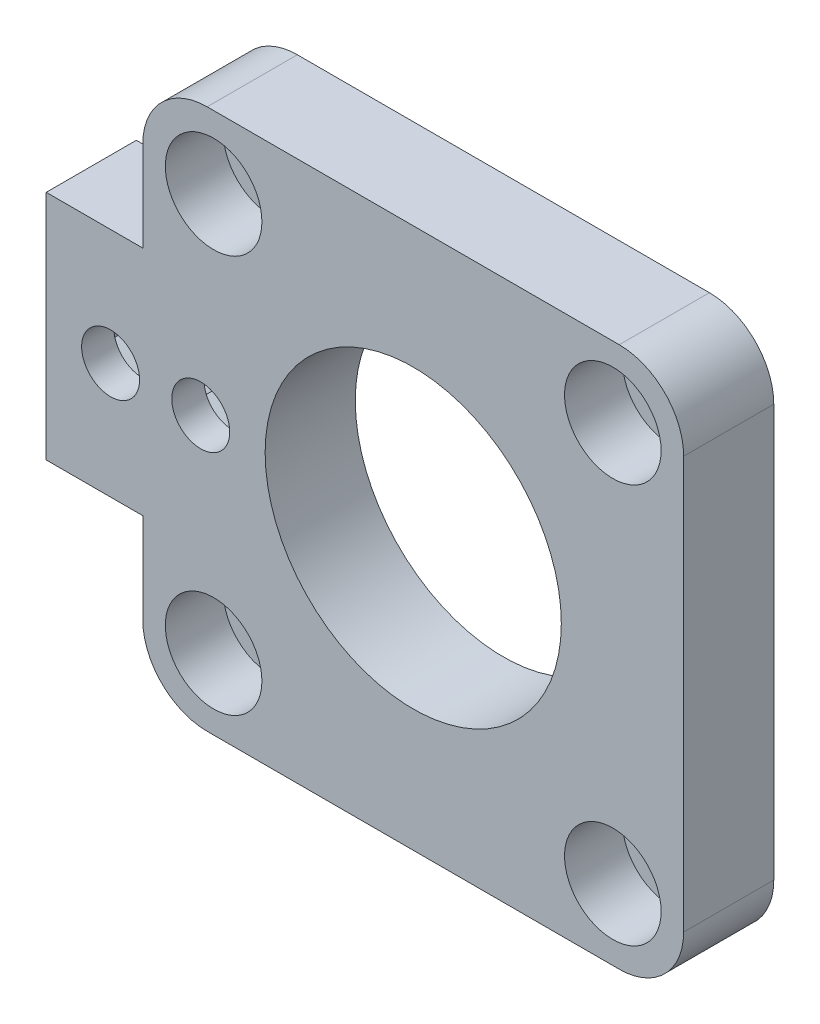
ISO-10303-21;
HEADER;
FILE_DESCRIPTION(('STEP AP214'),'2;1');
FILE_NAME('part.step','',(''),(''),'','','');
FILE_SCHEMA(('AUTOMOTIVE_DESIGN { 1 0 10303 214 1 1 1 1 }'));
ENDSEC;
DATA;
#1=APPLICATION_CONTEXT('core data for automotive mechanical design processes');
#2=APPLICATION_PROTOCOL_DEFINITION('international standard','automotive_design',2000,#1);
#3=PRODUCT_CONTEXT('',#1,'mechanical');
#4=PRODUCT('Part','Part','',(#3));
#5=PRODUCT_RELATED_PRODUCT_CATEGORY('part','',(#4));
#6=PRODUCT_DEFINITION_FORMATION('','',#4);
#7=PRODUCT_DEFINITION_CONTEXT('part definition',#1,'design');
#8=PRODUCT_DEFINITION('design','',#6,#7);
#9=PRODUCT_DEFINITION_SHAPE('','',#8);
#10=(LENGTH_UNIT() NAMED_UNIT(*) SI_UNIT(.MILLI.,.METRE.));
#11=(NAMED_UNIT(*) PLANE_ANGLE_UNIT() SI_UNIT($,.RADIAN.));
#12=(NAMED_UNIT(*) SI_UNIT($,.STERADIAN.) SOLID_ANGLE_UNIT());
#13=UNCERTAINTY_MEASURE_WITH_UNIT(LENGTH_MEASURE(1.E-05),#10,'distance_accuracy_value','');
#14=(GEOMETRIC_REPRESENTATION_CONTEXT(3) GLOBAL_UNCERTAINTY_ASSIGNED_CONTEXT((#13)) GLOBAL_UNIT_ASSIGNED_CONTEXT((#10,
#11,#12)) REPRESENTATION_CONTEXT('',''));
#15=CARTESIAN_POINT('',(0.,0.,0.));
#16=DIRECTION('',(0.,0.,1.));
#17=DIRECTION('',(1.,0.,0.));
#18=AXIS2_PLACEMENT_3D('',#15,#16,#17);
#19=CARTESIAN_POINT('',(-5.5,-5.5,7.));
#20=DIRECTION('',(0.,0.,-1.));
#21=DIRECTION('',(-1.,0.,0.));
#22=AXIS2_PLACEMENT_3D('',#19,#20,#21);
#23=CYLINDRICAL_SURFACE('',#22,1.75);
#24=CARTESIAN_POINT('',(-5.5,-5.5,0.));
#25=DIRECTION('',(0.,0.,1.));
#26=DIRECTION('',(1.,0.,0.));
#27=AXIS2_PLACEMENT_3D('',#24,#25,#26);
#28=CIRCLE('',#27,1.75);
#29=CARTESIAN_POINT('',(-3.75,-5.5,0.));
#30=VERTEX_POINT('',#29);
#31=EDGE_CURVE('E457',#30,#30,#28,.T.);
#32=ORIENTED_EDGE('',*,*,#31,.F.);
#33=EDGE_LOOP('',(#32));
#34=FACE_BOUND('',#33,.T.);
#35=CARTESIAN_POINT('',(-5.5,-5.5,2.5));
#36=DIRECTION('',(0.,0.,1.));
#37=DIRECTION('',(1.,0.,0.));
#38=AXIS2_PLACEMENT_3D('',#35,#36,#37);
#39=CIRCLE('',#38,1.75);
#40=CARTESIAN_POINT('',(-3.75,-5.5,2.5));
#41=VERTEX_POINT('',#40);
#42=EDGE_CURVE('E502',#41,#41,#39,.T.);
#43=ORIENTED_EDGE('',*,*,#42,.T.);
#44=EDGE_LOOP('',(#43));
#45=FACE_BOUND('',#44,.T.);
#46=ADVANCED_FACE('F167',(#34,#45),#23,.F.);
#47=CARTESIAN_POINT('',(-5.5,-36.5,7.));
#48=DIRECTION('',(0.,0.,-1.));
#49=DIRECTION('',(-1.,0.,0.));
#50=AXIS2_PLACEMENT_3D('',#47,#48,#49);
#51=CYLINDRICAL_SURFACE('',#50,1.75);
#52=CARTESIAN_POINT('',(-5.5,-36.5,0.));
#53=DIRECTION('',(0.,0.,1.));
#54=DIRECTION('',(1.,0.,0.));
#55=AXIS2_PLACEMENT_3D('',#52,#53,#54);
#56=CIRCLE('',#55,1.75);
#57=CARTESIAN_POINT('',(-3.74999999999999,-36.5,0.));
#58=VERTEX_POINT('',#57);
#59=EDGE_CURVE('E454',#58,#58,#56,.T.);
#60=ORIENTED_EDGE('',*,*,#59,.F.);
#61=EDGE_LOOP('',(#60));
#62=FACE_BOUND('',#61,.T.);
#63=CARTESIAN_POINT('',(-5.5,-36.5,2.5));
#64=DIRECTION('',(0.,0.,1.));
#65=DIRECTION('',(1.,0.,0.));
#66=AXIS2_PLACEMENT_3D('',#63,#64,#65);
#67=CIRCLE('',#66,1.75);
#68=CARTESIAN_POINT('',(-3.74999999999999,-36.5,2.5));
#69=VERTEX_POINT('',#68);
#70=EDGE_CURVE('E498',#69,#69,#67,.T.);
#71=ORIENTED_EDGE('',*,*,#70,.T.);
#72=EDGE_LOOP('',(#71));
#73=FACE_BOUND('',#72,.T.);
#74=ADVANCED_FACE('F589',(#62,#73),#51,.F.);
#75=CARTESIAN_POINT('',(-36.5,-36.5,7.));
#76=DIRECTION('',(0.,0.,-1.));
#77=DIRECTION('',(-1.,0.,0.));
#78=AXIS2_PLACEMENT_3D('',#75,#76,#77);
#79=CYLINDRICAL_SURFACE('',#78,1.75);
#80=CARTESIAN_POINT('',(-36.5,-36.5,0.));
#81=DIRECTION('',(0.,0.,1.));
#82=DIRECTION('',(1.,0.,0.));
#83=AXIS2_PLACEMENT_3D('',#80,#81,#82);
#84=CIRCLE('',#83,1.75);
#85=CARTESIAN_POINT('',(-34.75,-36.5,0.));
#86=VERTEX_POINT('',#85);
#87=EDGE_CURVE('E451',#86,#86,#84,.T.);
#88=ORIENTED_EDGE('',*,*,#87,.F.);
#89=EDGE_LOOP('',(#88));
#90=FACE_BOUND('',#89,.T.);
#91=CARTESIAN_POINT('',(-36.5,-36.5,2.5));
#92=DIRECTION('',(0.,0.,1.));
#93=DIRECTION('',(1.,0.,0.));
#94=AXIS2_PLACEMENT_3D('',#91,#92,#93);
#95=CIRCLE('',#94,1.75);
#96=CARTESIAN_POINT('',(-34.75,-36.5,2.5));
#97=VERTEX_POINT('',#96);
#98=EDGE_CURVE('E495',#97,#97,#95,.T.);
#99=ORIENTED_EDGE('',*,*,#98,.T.);
#100=EDGE_LOOP('',(#99));
#101=FACE_BOUND('',#100,.T.);
#102=ADVANCED_FACE('F595',(#90,#101),#79,.F.);
#103=CARTESIAN_POINT('',(-36.5,-5.61104091178623,7.));
#104=DIRECTION('',(0.,0.,-1.));
#105=DIRECTION('',(-1.,0.,0.));
#106=AXIS2_PLACEMENT_3D('',#103,#104,#105);
#107=CYLINDRICAL_SURFACE('',#106,1.75);
#108=CARTESIAN_POINT('',(-36.5,-5.61104091178623,0.));
#109=DIRECTION('',(0.,0.,1.));
#110=DIRECTION('',(1.,0.,0.));
#111=AXIS2_PLACEMENT_3D('',#108,#109,#110);
#112=CIRCLE('',#111,1.75);
#113=CARTESIAN_POINT('',(-34.75,-5.61104091178623,0.));
#114=VERTEX_POINT('',#113);
#115=EDGE_CURVE('E460',#114,#114,#112,.T.);
#116=ORIENTED_EDGE('',*,*,#115,.F.);
#117=EDGE_LOOP('',(#116));
#118=FACE_BOUND('',#117,.T.);
#119=CARTESIAN_POINT('',(-36.5,-5.61104091178623,2.5));
#120=DIRECTION('',(0.,0.,1.));
#121=DIRECTION('',(1.,0.,0.));
#122=AXIS2_PLACEMENT_3D('',#119,#120,#121);
#123=CIRCLE('',#122,1.75);
#124=CARTESIAN_POINT('',(-34.75,-5.61104091178623,2.5));
#125=VERTEX_POINT('',#124);
#126=EDGE_CURVE('E399',#125,#125,#123,.T.);
#127=ORIENTED_EDGE('',*,*,#126,.T.);
#128=EDGE_LOOP('',(#127));
#129=FACE_BOUND('',#128,.T.);
#130=ADVANCED_FACE('F601',(#118,#129),#107,.F.);
#131=CARTESIAN_POINT('',(-37.5,-21.,-10.));
#132=DIRECTION('',(0.,0.,1.));
#133=DIRECTION('',(1.,0.,0.));
#134=AXIS2_PLACEMENT_3D('',#131,#132,#133);
#135=CYLINDRICAL_SURFACE('',#134,2.25);
#136=CARTESIAN_POINT('',(-37.5,-21.,7.));
#137=DIRECTION('',(0.,0.,1.));
#138=DIRECTION('',(1.,0.,0.));
#139=AXIS2_PLACEMENT_3D('',#136,#137,#138);
#140=CIRCLE('',#139,2.25);
#141=CARTESIAN_POINT('',(-35.25,-21.,7.));
#142=VERTEX_POINT('',#141);
#143=EDGE_CURVE('E421',#142,#142,#140,.T.);
#144=ORIENTED_EDGE('',*,*,#143,.T.);
#145=EDGE_LOOP('',(#144));
#146=FACE_BOUND('',#145,.T.);
#147=CARTESIAN_POINT('',(-37.5,-21.,4.5));
#148=DIRECTION('',(0.,0.,-1.));
#149=DIRECTION('',(-1.,0.,0.));
#150=AXIS2_PLACEMENT_3D('',#147,#148,#149);
#151=CIRCLE('',#150,2.25);
#152=CARTESIAN_POINT('',(-39.75,-21.,4.5));
#153=VERTEX_POINT('',#152);
#154=EDGE_CURVE('E367',#153,#153,#151,.F.);
#155=ORIENTED_EDGE('',*,*,#154,.F.);
#156=EDGE_LOOP('',(#155));
#157=FACE_BOUND('',#156,.T.);
#158=ADVANCED_FACE('F732',(#146,#157),#135,.F.);
#159=CARTESIAN_POINT('',(-44.5,-21.,-10.));
#160=DIRECTION('',(0.,0.,1.));
#161=DIRECTION('',(1.,0.,0.));
#162=AXIS2_PLACEMENT_3D('',#159,#160,#161);
#163=CYLINDRICAL_SURFACE('',#162,2.25);
#164=CARTESIAN_POINT('',(-44.5,-21.,7.));
#165=DIRECTION('',(0.,0.,1.));
#166=DIRECTION('',(1.,0.,0.));
#167=AXIS2_PLACEMENT_3D('',#164,#165,#166);
#168=CIRCLE('',#167,2.25);
#169=CARTESIAN_POINT('',(-42.25,-21.,7.));
#170=VERTEX_POINT('',#169);
#171=EDGE_CURVE('E418',#170,#170,#168,.T.);
#172=ORIENTED_EDGE('',*,*,#171,.T.);
#173=EDGE_LOOP('',(#172));
#174=FACE_BOUND('',#173,.T.);
#175=CARTESIAN_POINT('',(-44.5,-21.,4.5));
#176=DIRECTION('',(0.,0.,-1.));
#177=DIRECTION('',(-1.,0.,0.));
#178=AXIS2_PLACEMENT_3D('',#175,#176,#177);
#179=CIRCLE('',#178,2.25);
#180=CARTESIAN_POINT('',(-46.75,-21.,4.5));
#181=VERTEX_POINT('',#180);
#182=EDGE_CURVE('E391',#181,#181,#179,.F.);
#183=ORIENTED_EDGE('',*,*,#182,.F.);
#184=EDGE_LOOP('',(#183));
#185=FACE_BOUND('',#184,.T.);
#186=ADVANCED_FACE('F841',(#174,#185),#163,.F.);
#187=CARTESIAN_POINT('',(0.,0.,7.));
#188=DIRECTION('',(0.,-1.,0.));
#189=DIRECTION('',(1.,0.,0.));
#190=AXIS2_PLACEMENT_3D('',#187,#188,#189);
#191=PLANE('',#190);
#192=DIRECTION('',(-1.,0.,0.));
#193=VECTOR('',#192,1.);
#194=CARTESIAN_POINT('',(0.,0.,0.));
#195=LINE('',#194,#193);
#196=CARTESIAN_POINT('',(-5.,0.,0.));
#197=VERTEX_POINT('',#196);
#198=CARTESIAN_POINT('',(-37.,0.,0.));
#199=VERTEX_POINT('',#198);
#200=EDGE_CURVE('E463',#197,#199,#195,.T.);
#201=ORIENTED_EDGE('',*,*,#200,.T.);
#202=DIRECTION('',(0.,0.,-1.));
#203=VECTOR('',#202,1.);
#204=CARTESIAN_POINT('',(-37.,0.,7.));
#205=LINE('',#204,#203);
#206=CARTESIAN_POINT('',(-37.,0.,7.));
#207=VERTEX_POINT('',#206);
#208=EDGE_CURVE('E518',#199,#207,#205,.F.);
#209=ORIENTED_EDGE('',*,*,#208,.T.);
#210=DIRECTION('',(-1.,0.,0.));
#211=VECTOR('',#210,1.);
#212=CARTESIAN_POINT('',(0.,0.,7.));
#213=LINE('',#212,#211);
#214=CARTESIAN_POINT('',(-5.,0.,7.));
#215=VERTEX_POINT('',#214);
#216=EDGE_CURVE('E428',#215,#207,#213,.T.);
#217=ORIENTED_EDGE('',*,*,#216,.F.);
#218=DIRECTION('',(0.,0.,-1.));
#219=VECTOR('',#218,1.);
#220=CARTESIAN_POINT('',(-5.,0.,0.));
#221=LINE('',#220,#219);
#222=EDGE_CURVE('E515',#215,#197,#221,.T.);
#223=ORIENTED_EDGE('',*,*,#222,.T.);
#224=EDGE_LOOP('',(#201,#209,#217,#223));
#225=FACE_BOUND('',#224,.T.);
#226=ADVANCED_FACE('F555',(#225),#191,.F.);
#227=CARTESIAN_POINT('',(-42.,0.,7.));
#228=DIRECTION('',(1.,0.,0.));
#229=DIRECTION('',(0.,1.,0.));
#230=AXIS2_PLACEMENT_3D('',#227,#228,#229);
#231=PLANE('',#230);
#232=DIRECTION('',(0.,-1.,0.));
#233=VECTOR('',#232,1.);
#234=CARTESIAN_POINT('',(-42.,0.,7.));
#235=LINE('',#234,#233);
#236=CARTESIAN_POINT('',(-42.,-5.00000000000001,7.));
#237=VERTEX_POINT('',#236);
#238=CARTESIAN_POINT('',(-42.,-12.,7.));
#239=VERTEX_POINT('',#238);
#240=EDGE_CURVE('E432',#237,#239,#235,.T.);
#241=ORIENTED_EDGE('',*,*,#240,.F.);
#242=DIRECTION('',(0.,0.,-1.));
#243=VECTOR('',#242,1.);
#244=CARTESIAN_POINT('',(-42.,-5.00000000000001,7.));
#245=LINE('',#244,#243);
#246=CARTESIAN_POINT('',(-42.,-5.00000000000001,0.));
#247=VERTEX_POINT('',#246);
#248=EDGE_CURVE('E491',#237,#247,#245,.T.);
#249=ORIENTED_EDGE('',*,*,#248,.T.);
#250=DIRECTION('',(0.,-1.,0.));
#251=VECTOR('',#250,1.);
#252=CARTESIAN_POINT('',(-42.,0.,0.));
#253=LINE('',#252,#251);
#254=CARTESIAN_POINT('',(-42.,-12.,0.));
#255=VERTEX_POINT('',#254);
#256=EDGE_CURVE('E466',#247,#255,#253,.T.);
#257=ORIENTED_EDGE('',*,*,#256,.T.);
#258=DIRECTION('',(0.,0.,-1.));
#259=VECTOR('',#258,1.);
#260=CARTESIAN_POINT('',(-42.,-12.,7.));
#261=LINE('',#260,#259);
#262=EDGE_CURVE('E488',#239,#255,#261,.T.);
#263=ORIENTED_EDGE('',*,*,#262,.F.);
#264=EDGE_LOOP('',(#241,#249,#257,#263));
#265=FACE_BOUND('',#264,.T.);
#266=ADVANCED_FACE('F563',(#265),#231,.F.);
#267=CARTESIAN_POINT('',(0.,-12.,7.));
#268=DIRECTION('',(0.,-1.,0.));
#269=DIRECTION('',(1.,0.,0.));
#270=AXIS2_PLACEMENT_3D('',#267,#268,#269);
#271=PLANE('',#270);
#272=DIRECTION('',(-1.,0.,0.));
#273=VECTOR('',#272,1.);
#274=CARTESIAN_POINT('',(0.,-12.,0.));
#275=LINE('',#274,#273);
#276=CARTESIAN_POINT('',(-49.5,-12.,0.));
#277=VERTEX_POINT('',#276);
#278=EDGE_CURVE('E468',#255,#277,#275,.T.);
#279=ORIENTED_EDGE('',*,*,#278,.T.);
#280=DIRECTION('',(0.,0.,-1.));
#281=VECTOR('',#280,1.);
#282=CARTESIAN_POINT('',(-49.5,-12.,7.));
#283=LINE('',#282,#281);
#284=CARTESIAN_POINT('',(-49.5,-12.,7.));
#285=VERTEX_POINT('',#284);
#286=EDGE_CURVE('E486',#285,#277,#283,.T.);
#287=ORIENTED_EDGE('',*,*,#286,.F.);
#288=DIRECTION('',(-1.,0.,0.));
#289=VECTOR('',#288,1.);
#290=CARTESIAN_POINT('',(0.,-12.,7.));
#291=LINE('',#290,#289);
#292=EDGE_CURVE('E434',#239,#285,#291,.T.);
#293=ORIENTED_EDGE('',*,*,#292,.F.);
#294=ORIENTED_EDGE('',*,*,#262,.T.);
#295=EDGE_LOOP('',(#279,#287,#293,#294));
#296=FACE_BOUND('',#295,.T.);
#297=ADVANCED_FACE('F569',(#296),#271,.F.);
#298=CARTESIAN_POINT('',(-49.5,0.,7.));
#299=DIRECTION('',(-1.,0.,0.));
#300=DIRECTION('',(0.,-1.,0.));
#301=AXIS2_PLACEMENT_3D('',#298,#299,#300);
#302=PLANE('',#301);
#303=DIRECTION('',(0.,1.,0.));
#304=VECTOR('',#303,1.);
#305=CARTESIAN_POINT('',(-49.5,0.,0.));
#306=LINE('',#305,#304);
#307=CARTESIAN_POINT('',(-49.5,-30.,0.));
#308=VERTEX_POINT('',#307);
#309=EDGE_CURVE('E472',#308,#277,#306,.T.);
#310=ORIENTED_EDGE('',*,*,#309,.F.);
#311=DIRECTION('',(0.,0.,-1.));
#312=VECTOR('',#311,1.);
#313=CARTESIAN_POINT('',(-49.5,-30.,7.));
#314=LINE('',#313,#312);
#315=CARTESIAN_POINT('',(-49.5,-30.,7.));
#316=VERTEX_POINT('',#315);
#317=EDGE_CURVE('E484',#316,#308,#314,.T.);
#318=ORIENTED_EDGE('',*,*,#317,.F.);
#319=DIRECTION('',(0.,1.,0.));
#320=VECTOR('',#319,1.);
#321=CARTESIAN_POINT('',(-49.5,0.,7.));
#322=LINE('',#321,#320);
#323=EDGE_CURVE('E437',#316,#285,#322,.T.);
#324=ORIENTED_EDGE('',*,*,#323,.T.);
#325=ORIENTED_EDGE('',*,*,#286,.T.);
#326=EDGE_LOOP('',(#310,#318,#324,#325));
#327=FACE_BOUND('',#326,.T.);
#328=ADVANCED_FACE('F875',(#327),#302,.T.);
#329=CARTESIAN_POINT('',(0.,-30.,7.));
#330=DIRECTION('',(0.,-1.,0.));
#331=DIRECTION('',(0.,0.,-1.));
#332=AXIS2_PLACEMENT_3D('',#329,#330,#331);
#333=PLANE('',#332);
#334=DIRECTION('',(-1.,0.,0.));
#335=VECTOR('',#334,1.);
#336=CARTESIAN_POINT('',(0.,-30.,0.));
#337=LINE('',#336,#335);
#338=CARTESIAN_POINT('',(-42.,-30.,0.));
#339=VERTEX_POINT('',#338);
#340=EDGE_CURVE('E475',#339,#308,#337,.T.);
#341=ORIENTED_EDGE('',*,*,#340,.F.);
#342=DIRECTION('',(0.,0.,-1.));
#343=VECTOR('',#342,1.);
#344=CARTESIAN_POINT('',(-42.,-30.,7.));
#345=LINE('',#344,#343);
#346=CARTESIAN_POINT('',(-42.,-30.,7.));
#347=VERTEX_POINT('',#346);
#348=EDGE_CURVE('E448',#347,#339,#345,.T.);
#349=ORIENTED_EDGE('',*,*,#348,.F.);
#350=DIRECTION('',(-1.,0.,0.));
#351=VECTOR('',#350,1.);
#352=CARTESIAN_POINT('',(0.,-30.,7.));
#353=LINE('',#352,#351);
#354=EDGE_CURVE('E440',#347,#316,#353,.T.);
#355=ORIENTED_EDGE('',*,*,#354,.T.);
#356=ORIENTED_EDGE('',*,*,#317,.T.);
#357=EDGE_LOOP('',(#341,#349,#355,#356));
#358=FACE_BOUND('',#357,.T.);
#359=ADVANCED_FACE('F576',(#358),#333,.T.);
#360=CARTESIAN_POINT('',(-42.,-37.,0.));
#361=VERTEX_POINT('',#360);
#362=EDGE_CURVE('E469',#339,#361,#253,.T.);
#363=ORIENTED_EDGE('',*,*,#362,.T.);
#364=DIRECTION('',(0.,0.,-1.));
#365=VECTOR('',#364,1.);
#366=CARTESIAN_POINT('',(-42.,-37.,7.));
#367=LINE('',#366,#365);
#368=CARTESIAN_POINT('',(-42.,-37.,7.));
#369=VERTEX_POINT('',#368);
#370=EDGE_CURVE('E12',#361,#369,#367,.F.);
#371=ORIENTED_EDGE('',*,*,#370,.T.);
#372=EDGE_CURVE('E435',#347,#369,#235,.T.);
#373=ORIENTED_EDGE('',*,*,#372,.F.);
#374=ORIENTED_EDGE('',*,*,#348,.T.);
#375=EDGE_LOOP('',(#363,#371,#373,#374));
#376=FACE_BOUND('',#375,.T.);
#377=ADVANCED_FACE('F581',(#376),#231,.F.);
#378=CARTESIAN_POINT('',(0.,-42.,7.));
#379=DIRECTION('',(0.,-1.,0.));
#380=DIRECTION('',(1.,0.,0.));
#381=AXIS2_PLACEMENT_3D('',#378,#379,#380);
#382=PLANE('',#381);
#383=DIRECTION('',(-1.,0.,0.));
#384=VECTOR('',#383,1.);
#385=CARTESIAN_POINT('',(0.,-42.,0.));
#386=LINE('',#385,#384);
#387=CARTESIAN_POINT('',(-4.99999999999999,-42.,0.));
#388=VERTEX_POINT('',#387);
#389=CARTESIAN_POINT('',(-37.,-42.,0.));
#390=VERTEX_POINT('',#389);
#391=EDGE_CURVE('E478',#388,#390,#386,.T.);
#392=ORIENTED_EDGE('',*,*,#391,.F.);
#393=DIRECTION('',(0.,0.,-1.));
#394=VECTOR('',#393,1.);
#395=CARTESIAN_POINT('',(-4.99999999999999,-42.,7.));
#396=LINE('',#395,#394);
#397=CARTESIAN_POINT('',(-4.99999999999999,-42.,7.));
#398=VERTEX_POINT('',#397);
#399=EDGE_CURVE('E175',#388,#398,#396,.F.);
#400=ORIENTED_EDGE('',*,*,#399,.T.);
#401=DIRECTION('',(-1.,0.,0.));
#402=VECTOR('',#401,1.);
#403=CARTESIAN_POINT('',(0.,-42.,7.));
#404=LINE('',#403,#402);
#405=CARTESIAN_POINT('',(-37.,-42.,7.));
#406=VERTEX_POINT('',#405);
#407=EDGE_CURVE('E443',#398,#406,#404,.T.);
#408=ORIENTED_EDGE('',*,*,#407,.T.);
#409=DIRECTION('',(0.,0.,-1.));
#410=VECTOR('',#409,1.);
#411=CARTESIAN_POINT('',(-37.,-42.,0.));
#412=LINE('',#411,#410);
#413=EDGE_CURVE('E531',#406,#390,#412,.T.);
#414=ORIENTED_EDGE('',*,*,#413,.T.);
#415=EDGE_LOOP('',(#392,#400,#408,#414));
#416=FACE_BOUND('',#415,.T.);
#417=ADVANCED_FACE('F536',(#416),#382,.T.);
#418=CARTESIAN_POINT('',(-21.,-21.,7.));
#419=DIRECTION('',(0.,0.,-1.));
#420=DIRECTION('',(-1.,0.,0.));
#421=AXIS2_PLACEMENT_3D('',#418,#419,#420);
#422=CYLINDRICAL_SURFACE('',#421,11.5);
#423=CARTESIAN_POINT('',(-21.,-21.,7.));
#424=DIRECTION('',(0.,0.,1.));
#425=DIRECTION('',(1.,0.,0.));
#426=AXIS2_PLACEMENT_3D('',#423,#424,#425);
#427=CIRCLE('',#426,11.5);
#428=CARTESIAN_POINT('',(-9.5,-21.,7.));
#429=VERTEX_POINT('',#428);
#430=EDGE_CURVE('E425',#429,#429,#427,.T.);
#431=ORIENTED_EDGE('',*,*,#430,.T.);
#432=EDGE_LOOP('',(#431));
#433=FACE_BOUND('',#432,.T.);
#434=CARTESIAN_POINT('',(-21.,-21.,0.));
#435=DIRECTION('',(0.,0.,1.));
#436=DIRECTION('',(1.,0.,0.));
#437=AXIS2_PLACEMENT_3D('',#434,#435,#436);
#438=CIRCLE('',#437,11.5);
#439=CARTESIAN_POINT('',(-9.5,-21.,0.));
#440=VERTEX_POINT('',#439);
#441=EDGE_CURVE('E424',#440,#440,#438,.T.);
#442=ORIENTED_EDGE('',*,*,#441,.F.);
#443=EDGE_LOOP('',(#442));
#444=FACE_BOUND('',#443,.T.);
#445=ADVANCED_FACE('F607',(#433,#444),#422,.F.);
#446=CARTESIAN_POINT('',(0.,0.,7.));
#447=DIRECTION('',(1.,0.,0.));
#448=DIRECTION('',(0.,1.,0.));
#449=AXIS2_PLACEMENT_3D('',#446,#447,#448);
#450=PLANE('',#449);
#451=DIRECTION('',(0.,-1.,0.));
#452=VECTOR('',#451,1.);
#453=CARTESIAN_POINT('',(0.,0.,0.));
#454=LINE('',#453,#452);
#455=CARTESIAN_POINT('',(0.,-5.,0.));
#456=VERTEX_POINT('',#455);
#457=CARTESIAN_POINT('',(0.,-37.,0.));
#458=VERTEX_POINT('',#457);
#459=EDGE_CURVE('E429',#456,#458,#454,.T.);
#460=ORIENTED_EDGE('',*,*,#459,.F.);
#461=DIRECTION('',(0.,0.,-1.));
#462=VECTOR('',#461,1.);
#463=CARTESIAN_POINT('',(0.,-5.,7.));
#464=LINE('',#463,#462);
#465=CARTESIAN_POINT('',(0.,-5.,7.));
#466=VERTEX_POINT('',#465);
#467=EDGE_CURVE('E189',#456,#466,#464,.F.);
#468=ORIENTED_EDGE('',*,*,#467,.T.);
#469=DIRECTION('',(0.,-1.,0.));
#470=VECTOR('',#469,1.);
#471=CARTESIAN_POINT('',(0.,0.,7.));
#472=LINE('',#471,#470);
#473=CARTESIAN_POINT('',(0.,-37.,7.));
#474=VERTEX_POINT('',#473);
#475=EDGE_CURVE('E446',#466,#474,#472,.T.);
#476=ORIENTED_EDGE('',*,*,#475,.T.);
#477=DIRECTION('',(0.,0.,-1.));
#478=VECTOR('',#477,1.);
#479=CARTESIAN_POINT('',(0.,-37.,7.));
#480=LINE('',#479,#478);
#481=EDGE_CURVE('E527',#474,#458,#480,.T.);
#482=ORIENTED_EDGE('',*,*,#481,.T.);
#483=EDGE_LOOP('',(#460,#468,#476,#482));
#484=FACE_BOUND('',#483,.T.);
#485=ADVANCED_FACE('F544',(#484),#450,.T.);
#486=CARTESIAN_POINT('',(0.,0.,7.));
#487=DIRECTION('',(0.,0.,1.));
#488=DIRECTION('',(1.,0.,0.));
#489=AXIS2_PLACEMENT_3D('',#486,#487,#488);
#490=PLANE('',#489);
#491=CARTESIAN_POINT('',(-5.5,-5.5,7.));
#492=DIRECTION('',(0.,0.,1.));
#493=DIRECTION('',(1.,0.,0.));
#494=AXIS2_PLACEMENT_3D('',#491,#492,#493);
#495=CIRCLE('',#494,3.75);
#496=CARTESIAN_POINT('',(-1.75,-5.5,7.));
#497=VERTEX_POINT('',#496);
#498=EDGE_CURVE('E926',#497,#497,#495,.T.);
#499=ORIENTED_EDGE('',*,*,#498,.F.);
#500=EDGE_LOOP('',(#499));
#501=FACE_BOUND('',#500,.T.);
#502=CARTESIAN_POINT('',(-5.5,-36.5,7.));
#503=DIRECTION('',(0.,0.,1.));
#504=DIRECTION('',(1.,0.,0.));
#505=AXIS2_PLACEMENT_3D('',#502,#503,#504);
#506=CIRCLE('',#505,3.75);
#507=CARTESIAN_POINT('',(-1.74999999999999,-36.5,7.));
#508=VERTEX_POINT('',#507);
#509=EDGE_CURVE('E930',#508,#508,#506,.T.);
#510=ORIENTED_EDGE('',*,*,#509,.F.);
#511=EDGE_LOOP('',(#510));
#512=FACE_BOUND('',#511,.T.);
#513=CARTESIAN_POINT('',(-36.5,-36.5,7.));
#514=DIRECTION('',(0.,0.,1.));
#515=DIRECTION('',(1.,0.,0.));
#516=AXIS2_PLACEMENT_3D('',#513,#514,#515);
#517=CIRCLE('',#516,3.75000000000001);
#518=CARTESIAN_POINT('',(-32.75,-36.5,7.));
#519=VERTEX_POINT('',#518);
#520=EDGE_CURVE('E934',#519,#519,#517,.T.);
#521=ORIENTED_EDGE('',*,*,#520,.F.);
#522=EDGE_LOOP('',(#521));
#523=FACE_BOUND('',#522,.T.);
#524=CARTESIAN_POINT('',(-36.5,-5.61104091178623,7.));
#525=DIRECTION('',(0.,0.,1.));
#526=DIRECTION('',(1.,0.,0.));
#527=AXIS2_PLACEMENT_3D('',#524,#525,#526);
#528=CIRCLE('',#527,3.75000000000001);
#529=CARTESIAN_POINT('',(-32.75,-5.61104091178623,7.));
#530=VERTEX_POINT('',#529);
#531=EDGE_CURVE('E349',#530,#530,#528,.T.);
#532=ORIENTED_EDGE('',*,*,#531,.F.);
#533=EDGE_LOOP('',(#532));
#534=FACE_BOUND('',#533,.T.);
#535=ORIENTED_EDGE('',*,*,#171,.F.);
#536=EDGE_LOOP('',(#535));
#537=FACE_BOUND('',#536,.T.);
#538=ORIENTED_EDGE('',*,*,#143,.F.);
#539=EDGE_LOOP('',(#538));
#540=FACE_BOUND('',#539,.T.);
#541=ORIENTED_EDGE('',*,*,#430,.F.);
#542=EDGE_LOOP('',(#541));
#543=FACE_BOUND('',#542,.T.);
#544=ORIENTED_EDGE('',*,*,#216,.T.);
#545=CARTESIAN_POINT('',(-37.,-5.,7.));
#546=DIRECTION('',(0.,0.,1.));
#547=DIRECTION('',(1.,0.,0.));
#548=AXIS2_PLACEMENT_3D('',#545,#546,#547);
#549=CIRCLE('',#548,5.);
#550=EDGE_CURVE('E525',#207,#237,#549,.T.);
#551=ORIENTED_EDGE('',*,*,#550,.T.);
#552=ORIENTED_EDGE('',*,*,#240,.T.);
#553=ORIENTED_EDGE('',*,*,#292,.T.);
#554=ORIENTED_EDGE('',*,*,#323,.F.);
#555=ORIENTED_EDGE('',*,*,#354,.F.);
#556=ORIENTED_EDGE('',*,*,#372,.T.);
#557=CARTESIAN_POINT('',(-37.,-37.,7.));
#558=DIRECTION('',(0.,0.,1.));
#559=DIRECTION('',(1.,0.,0.));
#560=AXIS2_PLACEMENT_3D('',#557,#558,#559);
#561=CIRCLE('',#560,5.);
#562=EDGE_CURVE('E520',#369,#406,#561,.T.);
#563=ORIENTED_EDGE('',*,*,#562,.T.);
#564=ORIENTED_EDGE('',*,*,#407,.F.);
#565=CARTESIAN_POINT('',(-5.,-37.,7.));
#566=DIRECTION('',(0.,0.,1.));
#567=DIRECTION('',(1.,0.,0.));
#568=AXIS2_PLACEMENT_3D('',#565,#566,#567);
#569=CIRCLE('',#568,5.);
#570=EDGE_CURVE('E182',#398,#474,#569,.T.);
#571=ORIENTED_EDGE('',*,*,#570,.T.);
#572=ORIENTED_EDGE('',*,*,#475,.F.);
#573=CARTESIAN_POINT('',(-5.,-5.,7.));
#574=DIRECTION('',(0.,0.,1.));
#575=DIRECTION('',(1.,0.,0.));
#576=AXIS2_PLACEMENT_3D('',#573,#574,#575);
#577=CIRCLE('',#576,5.);
#578=EDGE_CURVE('E523',#466,#215,#577,.T.);
#579=ORIENTED_EDGE('',*,*,#578,.T.);
#580=EDGE_LOOP('',(#544,#551,#552,#553,#554,#555,#556,#563,#564,#571,#572,#579));
#581=FACE_BOUND('',#580,.T.);
#582=ADVANCED_FACE('F539',(#501,#512,#523,#534,#537,#540,#543,#581),#490,.T.);
#583=CARTESIAN_POINT('',(0.,0.,0.));
#584=DIRECTION('',(0.,0.,1.));
#585=DIRECTION('',(1.,0.,0.));
#586=AXIS2_PLACEMENT_3D('',#583,#584,#585);
#587=PLANE('',#586);
#588=DIRECTION('',(-0.866025403784439,0.5,0.));
#589=VECTOR('',#588,1.);
#590=CARTESIAN_POINT('',(-22.0932667397366,-38.2666604983954,0.));
#591=LINE('',#590,#589);
#592=CARTESIAN_POINT('',(-44.5,-25.3301270189222,0.));
#593=VERTEX_POINT('',#592);
#594=CARTESIAN_POINT('',(-48.25,-23.1650635094611,0.));
#595=VERTEX_POINT('',#594);
#596=EDGE_CURVE('E398',#593,#595,#591,.T.);
#597=ORIENTED_EDGE('',*,*,#596,.F.);
#598=DIRECTION('',(-0.866025403784438,-0.500000000000001,0.));
#599=VECTOR('',#598,1.);
#600=CARTESIAN_POINT('',(-0.156733260263409,0.27146997001214,0.));
#601=LINE('',#600,#599);
#602=CARTESIAN_POINT('',(-41.,-23.3094010767585,0.));
#603=VERTEX_POINT('',#602);
#604=EDGE_CURVE('E395',#603,#593,#601,.T.);
#605=ORIENTED_EDGE('',*,*,#604,.F.);
#606=DIRECTION('',(-0.866025403784438,0.500000000000001,0.));
#607=VECTOR('',#606,1.);
#608=CARTESIAN_POINT('',(-20.3432667397367,-35.2355715851499,0.));
#609=LINE('',#608,#607);
#610=CARTESIAN_POINT('',(-37.5,-25.3301270189222,0.));
#611=VERTEX_POINT('',#610);
#612=EDGE_CURVE('E360',#611,#603,#609,.T.);
#613=ORIENTED_EDGE('',*,*,#612,.F.);
#614=DIRECTION('',(-0.866025403784439,-0.5,0.));
#615=VECTOR('',#614,1.);
#616=CARTESIAN_POINT('',(1.59326673973662,-2.75961894323345,0.));
#617=LINE('',#616,#615);
#618=CARTESIAN_POINT('',(-33.75,-23.1650635094611,0.));
#619=VERTEX_POINT('',#618);
#620=EDGE_CURVE('E357',#619,#611,#617,.T.);
#621=ORIENTED_EDGE('',*,*,#620,.F.);
#622=DIRECTION('',(0.,-1.,0.));
#623=VECTOR('',#622,1.);
#624=CARTESIAN_POINT('',(-33.75,0.,0.));
#625=LINE('',#624,#623);
#626=CARTESIAN_POINT('',(-33.75,-18.8349364905389,0.));
#627=VERTEX_POINT('',#626);
#628=EDGE_CURVE('E324',#627,#619,#625,.T.);
#629=ORIENTED_EDGE('',*,*,#628,.F.);
#630=DIRECTION('',(0.866025403784438,-0.5,0.));
#631=VECTOR('',#630,1.);
#632=CARTESIAN_POINT('',(-16.5932667397366,-28.7403810567666,0.));
#633=LINE('',#632,#631);
#634=CARTESIAN_POINT('',(-37.5,-16.6698729810778,0.));
#635=VERTEX_POINT('',#634);
#636=EDGE_CURVE('E343',#635,#627,#633,.T.);
#637=ORIENTED_EDGE('',*,*,#636,.F.);
#638=DIRECTION('',(0.866025403784439,0.5,0.));
#639=VECTOR('',#638,1.);
#640=CARTESIAN_POINT('',(-2.15673326026339,3.73557158514987,0.));
#641=LINE('',#640,#639);
#642=CARTESIAN_POINT('',(-41.,-18.6905989232415,0.));
#643=VERTEX_POINT('',#642);
#644=EDGE_CURVE('E346',#643,#635,#641,.T.);
#645=ORIENTED_EDGE('',*,*,#644,.F.);
#646=DIRECTION('',(0.866025403784439,-0.5,0.));
#647=VECTOR('',#646,1.);
#648=CARTESIAN_POINT('',(-18.3432667397366,-31.7714699700121,0.));
#649=LINE('',#648,#647);
#650=CARTESIAN_POINT('',(-44.5,-16.6698729810778,0.));
#651=VERTEX_POINT('',#650);
#652=EDGE_CURVE('E379',#651,#643,#649,.T.);
#653=ORIENTED_EDGE('',*,*,#652,.F.);
#654=DIRECTION('',(0.866025403784439,0.5,0.));
#655=VECTOR('',#654,1.);
#656=CARTESIAN_POINT('',(-3.9067332602634,6.76666049839542,0.));
#657=LINE('',#656,#655);
#658=CARTESIAN_POINT('',(-48.25,-18.8349364905389,0.));
#659=VERTEX_POINT('',#658);
#660=EDGE_CURVE('E405',#659,#651,#657,.T.);
#661=ORIENTED_EDGE('',*,*,#660,.F.);
#662=DIRECTION('',(0.,1.,0.));
#663=VECTOR('',#662,1.);
#664=CARTESIAN_POINT('',(-48.25,0.,0.));
#665=LINE('',#664,#663);
#666=EDGE_CURVE('E402',#595,#659,#665,.T.);
#667=ORIENTED_EDGE('',*,*,#666,.F.);
#668=EDGE_LOOP('',(#597,#605,#613,#621,#629,#637,#645,#653,#661,#667));
#669=FACE_BOUND('',#668,.T.);
#670=ORIENTED_EDGE('',*,*,#441,.T.);
#671=EDGE_LOOP('',(#670));
#672=FACE_BOUND('',#671,.T.);
#673=ORIENTED_EDGE('',*,*,#87,.T.);
#674=EDGE_LOOP('',(#673));
#675=FACE_BOUND('',#674,.T.);
#676=ORIENTED_EDGE('',*,*,#59,.T.);
#677=EDGE_LOOP('',(#676));
#678=FACE_BOUND('',#677,.T.);
#679=ORIENTED_EDGE('',*,*,#31,.T.);
#680=EDGE_LOOP('',(#679));
#681=FACE_BOUND('',#680,.T.);
#682=ORIENTED_EDGE('',*,*,#115,.T.);
#683=EDGE_LOOP('',(#682));
#684=FACE_BOUND('',#683,.T.);
#685=ORIENTED_EDGE('',*,*,#256,.F.);
#686=CARTESIAN_POINT('',(-37.,-5.,0.));
#687=DIRECTION('',(0.,0.,1.));
#688=DIRECTION('',(1.,0.,0.));
#689=AXIS2_PLACEMENT_3D('',#686,#687,#688);
#690=CIRCLE('',#689,5.);
#691=EDGE_CURVE('E513',#247,#199,#690,.F.);
#692=ORIENTED_EDGE('',*,*,#691,.T.);
#693=ORIENTED_EDGE('',*,*,#200,.F.);
#694=CARTESIAN_POINT('',(-5.,-5.,0.));
#695=DIRECTION('',(0.,0.,1.));
#696=DIRECTION('',(1.,0.,0.));
#697=AXIS2_PLACEMENT_3D('',#694,#695,#696);
#698=CIRCLE('',#697,5.);
#699=EDGE_CURVE('E511',#197,#456,#698,.F.);
#700=ORIENTED_EDGE('',*,*,#699,.T.);
#701=ORIENTED_EDGE('',*,*,#459,.T.);
#702=CARTESIAN_POINT('',(-5.,-37.,0.));
#703=DIRECTION('',(0.,0.,1.));
#704=DIRECTION('',(1.,0.,0.));
#705=AXIS2_PLACEMENT_3D('',#702,#703,#704);
#706=CIRCLE('',#705,5.);
#707=EDGE_CURVE('E509',#458,#388,#706,.F.);
#708=ORIENTED_EDGE('',*,*,#707,.T.);
#709=ORIENTED_EDGE('',*,*,#391,.T.);
#710=CARTESIAN_POINT('',(-37.,-37.,0.));
#711=DIRECTION('',(0.,0.,1.));
#712=DIRECTION('',(1.,0.,0.));
#713=AXIS2_PLACEMENT_3D('',#710,#711,#712);
#714=CIRCLE('',#713,5.);
#715=EDGE_CURVE('E507',#390,#361,#714,.F.);
#716=ORIENTED_EDGE('',*,*,#715,.T.);
#717=ORIENTED_EDGE('',*,*,#362,.F.);
#718=ORIENTED_EDGE('',*,*,#340,.T.);
#719=ORIENTED_EDGE('',*,*,#309,.T.);
#720=ORIENTED_EDGE('',*,*,#278,.F.);
#721=EDGE_LOOP('',(#685,#692,#693,#700,#701,#708,#709,#716,#717,#718,#719,#720));
#722=FACE_BOUND('',#721,.T.);
#723=ADVANCED_FACE('F547',(#669,#672,#675,#678,#681,#684,#722),#587,.F.);
#724=CARTESIAN_POINT('',(0.,0.,4.5));
#725=DIRECTION('',(0.,0.,-1.));
#726=DIRECTION('',(-1.,0.,0.));
#727=AXIS2_PLACEMENT_3D('',#724,#725,#726);
#728=PLANE('',#727);
#729=DIRECTION('',(0.866025403784439,0.5,0.));
#730=VECTOR('',#729,1.);
#731=CARTESIAN_POINT('',(-2.15673326026339,3.73557158514987,4.5));
#732=LINE('',#731,#730);
#733=CARTESIAN_POINT('',(-41.,-18.6905989232415,4.5));
#734=VERTEX_POINT('',#733);
#735=CARTESIAN_POINT('',(-37.5,-16.6698729810778,4.5));
#736=VERTEX_POINT('',#735);
#737=EDGE_CURVE('E353',#734,#736,#732,.T.);
#738=ORIENTED_EDGE('',*,*,#737,.T.);
#739=DIRECTION('',(0.866025403784438,-0.5,0.));
#740=VECTOR('',#739,1.);
#741=CARTESIAN_POINT('',(-16.5932667397366,-28.7403810567666,4.5));
#742=LINE('',#741,#740);
#743=CARTESIAN_POINT('',(-33.75,-18.8349364905389,4.5));
#744=VERTEX_POINT('',#743);
#745=EDGE_CURVE('E329',#736,#744,#742,.T.);
#746=ORIENTED_EDGE('',*,*,#745,.T.);
#747=DIRECTION('',(0.,-1.,0.));
#748=VECTOR('',#747,1.);
#749=CARTESIAN_POINT('',(-33.75,0.,4.5));
#750=LINE('',#749,#748);
#751=CARTESIAN_POINT('',(-33.75,-23.1650635094611,4.5));
#752=VERTEX_POINT('',#751);
#753=EDGE_CURVE('E321',#744,#752,#750,.T.);
#754=ORIENTED_EDGE('',*,*,#753,.T.);
#755=DIRECTION('',(-0.866025403784439,-0.5,0.));
#756=VECTOR('',#755,1.);
#757=CARTESIAN_POINT('',(1.59326673973662,-2.75961894323345,4.5));
#758=LINE('',#757,#756);
#759=CARTESIAN_POINT('',(-37.5,-25.3301270189222,4.5));
#760=VERTEX_POINT('',#759);
#761=EDGE_CURVE('E332',#752,#760,#758,.T.);
#762=ORIENTED_EDGE('',*,*,#761,.T.);
#763=DIRECTION('',(-0.866025403784438,0.500000000000001,0.));
#764=VECTOR('',#763,1.);
#765=CARTESIAN_POINT('',(-20.3432667397367,-35.2355715851499,4.5));
#766=LINE('',#765,#764);
#767=CARTESIAN_POINT('',(-41.,-23.3094010767585,4.5));
#768=VERTEX_POINT('',#767);
#769=EDGE_CURVE('E337',#760,#768,#766,.T.);
#770=ORIENTED_EDGE('',*,*,#769,.T.);
#771=DIRECTION('',(-0.866025403784438,-0.500000000000001,0.));
#772=VECTOR('',#771,1.);
#773=CARTESIAN_POINT('',(-0.156733260263409,0.27146997001214,4.5));
#774=LINE('',#773,#772);
#775=CARTESIAN_POINT('',(-44.5,-25.3301270189222,4.5));
#776=VERTEX_POINT('',#775);
#777=EDGE_CURVE('E375',#768,#776,#774,.T.);
#778=ORIENTED_EDGE('',*,*,#777,.T.);
#779=DIRECTION('',(-0.866025403784439,0.5,0.));
#780=VECTOR('',#779,1.);
#781=CARTESIAN_POINT('',(-22.0932667397366,-38.2666604983954,4.5));
#782=LINE('',#781,#780);
#783=CARTESIAN_POINT('',(-48.25,-23.1650635094611,4.5));
#784=VERTEX_POINT('',#783);
#785=EDGE_CURVE('E378',#776,#784,#782,.T.);
#786=ORIENTED_EDGE('',*,*,#785,.T.);
#787=DIRECTION('',(0.,1.,0.));
#788=VECTOR('',#787,1.);
#789=CARTESIAN_POINT('',(-48.25,0.,4.5));
#790=LINE('',#789,#788);
#791=CARTESIAN_POINT('',(-48.25,-18.8349364905389,4.5));
#792=VERTEX_POINT('',#791);
#793=EDGE_CURVE('E382',#784,#792,#790,.T.);
#794=ORIENTED_EDGE('',*,*,#793,.T.);
#795=DIRECTION('',(0.866025403784439,0.5,0.));
#796=VECTOR('',#795,1.);
#797=CARTESIAN_POINT('',(-3.9067332602634,6.76666049839542,4.5));
#798=LINE('',#797,#796);
#799=CARTESIAN_POINT('',(-44.5,-16.6698729810778,4.5));
#800=VERTEX_POINT('',#799);
#801=EDGE_CURVE('E385',#792,#800,#798,.T.);
#802=ORIENTED_EDGE('',*,*,#801,.T.);
#803=DIRECTION('',(0.866025403784439,-0.5,0.));
#804=VECTOR('',#803,1.);
#805=CARTESIAN_POINT('',(-18.3432667397366,-31.7714699700121,4.5));
#806=LINE('',#805,#804);
#807=EDGE_CURVE('E388',#800,#734,#806,.T.);
#808=ORIENTED_EDGE('',*,*,#807,.T.);
#809=EDGE_LOOP('',(#738,#746,#754,#762,#770,#778,#786,#794,#802,#808));
#810=FACE_BOUND('',#809,.T.);
#811=ORIENTED_EDGE('',*,*,#182,.T.);
#812=EDGE_LOOP('',(#811));
#813=FACE_BOUND('',#812,.T.);
#814=ORIENTED_EDGE('',*,*,#154,.T.);
#815=EDGE_LOOP('',(#814));
#816=FACE_BOUND('',#815,.T.);
#817=ADVANCED_FACE('F340',(#810,#813,#816),#728,.T.);
#818=CARTESIAN_POINT('',(1.59326673973662,-2.75961894323345,4.5));
#819=DIRECTION('',(0.5,-0.866025403784439,0.));
#820=DIRECTION('',(0.866025403784439,0.5,0.));
#821=AXIS2_PLACEMENT_3D('',#818,#819,#820);
#822=PLANE('',#821);
#823=ORIENTED_EDGE('',*,*,#620,.T.);
#824=DIRECTION('',(0.,0.,-1.));
#825=VECTOR('',#824,1.);
#826=CARTESIAN_POINT('',(-37.5,-25.3301270189222,4.5));
#827=LINE('',#826,#825);
#828=EDGE_CURVE('E328',#760,#611,#827,.T.);
#829=ORIENTED_EDGE('',*,*,#828,.F.);
#830=ORIENTED_EDGE('',*,*,#761,.F.);
#831=DIRECTION('',(0.,0.,-1.));
#832=VECTOR('',#831,1.);
#833=CARTESIAN_POINT('',(-33.75,-23.1650635094611,4.5));
#834=LINE('',#833,#832);
#835=EDGE_CURVE('E317',#752,#619,#834,.T.);
#836=ORIENTED_EDGE('',*,*,#835,.T.);
#837=EDGE_LOOP('',(#823,#829,#830,#836));
#838=FACE_BOUND('',#837,.T.);
#839=ADVANCED_FACE('F333',(#838),#822,.F.);
#840=CARTESIAN_POINT('',(-33.75,0.,4.5));
#841=DIRECTION('',(1.,0.,0.));
#842=DIRECTION('',(0.,0.,-1.));
#843=AXIS2_PLACEMENT_3D('',#840,#841,#842);
#844=PLANE('',#843);
#845=ORIENTED_EDGE('',*,*,#628,.T.);
#846=ORIENTED_EDGE('',*,*,#835,.F.);
#847=ORIENTED_EDGE('',*,*,#753,.F.);
#848=DIRECTION('',(0.,0.,-1.));
#849=VECTOR('',#848,1.);
#850=CARTESIAN_POINT('',(-33.75,-18.8349364905389,4.5));
#851=LINE('',#850,#849);
#852=EDGE_CURVE('E365',#744,#627,#851,.T.);
#853=ORIENTED_EDGE('',*,*,#852,.T.);
#854=EDGE_LOOP('',(#845,#846,#847,#853));
#855=FACE_BOUND('',#854,.T.);
#856=ADVANCED_FACE('F319',(#855),#844,.F.);
#857=CARTESIAN_POINT('',(-16.5932667397366,-28.7403810567666,4.5));
#858=DIRECTION('',(0.5,0.866025403784438,0.));
#859=DIRECTION('',(-0.866025403784439,0.5,0.));
#860=AXIS2_PLACEMENT_3D('',#857,#858,#859);
#861=PLANE('',#860);
#862=ORIENTED_EDGE('',*,*,#636,.T.);
#863=ORIENTED_EDGE('',*,*,#852,.F.);
#864=ORIENTED_EDGE('',*,*,#745,.F.);
#865=DIRECTION('',(0.,0.,-1.));
#866=VECTOR('',#865,1.);
#867=CARTESIAN_POINT('',(-37.5,-16.6698729810778,4.5));
#868=LINE('',#867,#866);
#869=EDGE_CURVE('E368',#736,#635,#868,.T.);
#870=ORIENTED_EDGE('',*,*,#869,.T.);
#871=EDGE_LOOP('',(#862,#863,#864,#870));
#872=FACE_BOUND('',#871,.T.);
#873=ADVANCED_FACE('F796',(#872),#861,.F.);
#874=CARTESIAN_POINT('',(-2.15673326026339,3.73557158514987,4.5));
#875=DIRECTION('',(-0.5,0.866025403784438,0.));
#876=DIRECTION('',(-0.866025403784439,-0.5,0.));
#877=AXIS2_PLACEMENT_3D('',#874,#875,#876);
#878=PLANE('',#877);
#879=ORIENTED_EDGE('',*,*,#644,.T.);
#880=ORIENTED_EDGE('',*,*,#869,.F.);
#881=ORIENTED_EDGE('',*,*,#737,.F.);
#882=DIRECTION('',(0.,0.,-1.));
#883=VECTOR('',#882,1.);
#884=CARTESIAN_POINT('',(-41.,-18.6905989232415,4.5));
#885=LINE('',#884,#883);
#886=EDGE_CURVE('E370',#734,#643,#885,.T.);
#887=ORIENTED_EDGE('',*,*,#886,.T.);
#888=EDGE_LOOP('',(#879,#880,#881,#887));
#889=FACE_BOUND('',#888,.T.);
#890=ADVANCED_FACE('F784',(#889),#878,.F.);
#891=CARTESIAN_POINT('',(-20.3432667397367,-35.2355715851499,4.5));
#892=DIRECTION('',(-0.500000000000001,-0.866025403784438,0.));
#893=DIRECTION('',(0.866025403784438,-0.500000000000001,0.));
#894=AXIS2_PLACEMENT_3D('',#891,#892,#893);
#895=PLANE('',#894);
#896=ORIENTED_EDGE('',*,*,#612,.T.);
#897=DIRECTION('',(0.,0.,-1.));
#898=VECTOR('',#897,1.);
#899=CARTESIAN_POINT('',(-41.,-23.3094010767585,4.5));
#900=LINE('',#899,#898);
#901=EDGE_CURVE('E372',#768,#603,#900,.T.);
#902=ORIENTED_EDGE('',*,*,#901,.F.);
#903=ORIENTED_EDGE('',*,*,#769,.F.);
#904=ORIENTED_EDGE('',*,*,#828,.T.);
#905=EDGE_LOOP('',(#896,#902,#903,#904));
#906=FACE_BOUND('',#905,.T.);
#907=ADVANCED_FACE('F775',(#906),#895,.F.);
#908=CARTESIAN_POINT('',(-48.25,0.,4.5));
#909=DIRECTION('',(-1.,0.,0.));
#910=DIRECTION('',(0.,0.,1.));
#911=AXIS2_PLACEMENT_3D('',#908,#909,#910);
#912=PLANE('',#911);
#913=ORIENTED_EDGE('',*,*,#666,.T.);
#914=DIRECTION('',(0.,0.,-1.));
#915=VECTOR('',#914,1.);
#916=CARTESIAN_POINT('',(-48.25,-18.8349364905389,4.5));
#917=LINE('',#916,#915);
#918=EDGE_CURVE('E411',#792,#659,#917,.T.);
#919=ORIENTED_EDGE('',*,*,#918,.F.);
#920=ORIENTED_EDGE('',*,*,#793,.F.);
#921=DIRECTION('',(0.,0.,-1.));
#922=VECTOR('',#921,1.);
#923=CARTESIAN_POINT('',(-48.25,-23.1650635094611,4.5));
#924=LINE('',#923,#922);
#925=EDGE_CURVE('E413',#784,#595,#924,.T.);
#926=ORIENTED_EDGE('',*,*,#925,.T.);
#927=EDGE_LOOP('',(#913,#919,#920,#926));
#928=FACE_BOUND('',#927,.T.);
#929=ADVANCED_FACE('F766',(#928),#912,.F.);
#930=CARTESIAN_POINT('',(-3.9067332602634,6.76666049839542,4.5));
#931=DIRECTION('',(-0.5,0.866025403784438,0.));
#932=DIRECTION('',(-0.866025403784439,-0.5,0.));
#933=AXIS2_PLACEMENT_3D('',#930,#931,#932);
#934=PLANE('',#933);
#935=ORIENTED_EDGE('',*,*,#660,.T.);
#936=DIRECTION('',(0.,0.,-1.));
#937=VECTOR('',#936,1.);
#938=CARTESIAN_POINT('',(-44.5,-16.6698729810778,4.5));
#939=LINE('',#938,#937);
#940=EDGE_CURVE('E358',#800,#651,#939,.T.);
#941=ORIENTED_EDGE('',*,*,#940,.F.);
#942=ORIENTED_EDGE('',*,*,#801,.F.);
#943=ORIENTED_EDGE('',*,*,#918,.T.);
#944=EDGE_LOOP('',(#935,#941,#942,#943));
#945=FACE_BOUND('',#944,.T.);
#946=ADVANCED_FACE('F757',(#945),#934,.F.);
#947=CARTESIAN_POINT('',(-22.0932667397366,-38.2666604983954,4.5));
#948=DIRECTION('',(-0.5,-0.866025403784439,0.));
#949=DIRECTION('',(0.866025403784439,-0.5,0.));
#950=AXIS2_PLACEMENT_3D('',#947,#948,#949);
#951=PLANE('',#950);
#952=ORIENTED_EDGE('',*,*,#596,.T.);
#953=ORIENTED_EDGE('',*,*,#925,.F.);
#954=ORIENTED_EDGE('',*,*,#785,.F.);
#955=DIRECTION('',(0.,0.,-1.));
#956=VECTOR('',#955,1.);
#957=CARTESIAN_POINT('',(-44.5,-25.3301270189222,4.5));
#958=LINE('',#957,#956);
#959=EDGE_CURVE('E394',#776,#593,#958,.T.);
#960=ORIENTED_EDGE('',*,*,#959,.T.);
#961=EDGE_LOOP('',(#952,#953,#954,#960));
#962=FACE_BOUND('',#961,.T.);
#963=ADVANCED_FACE('F748',(#962),#951,.F.);
#964=CARTESIAN_POINT('',(-0.156733260263409,0.27146997001214,4.5));
#965=DIRECTION('',(0.500000000000001,-0.866025403784438,0.));
#966=DIRECTION('',(0.866025403784438,0.500000000000001,0.));
#967=AXIS2_PLACEMENT_3D('',#964,#965,#966);
#968=PLANE('',#967);
#969=ORIENTED_EDGE('',*,*,#604,.T.);
#970=ORIENTED_EDGE('',*,*,#959,.F.);
#971=ORIENTED_EDGE('',*,*,#777,.F.);
#972=ORIENTED_EDGE('',*,*,#901,.T.);
#973=EDGE_LOOP('',(#969,#970,#971,#972));
#974=FACE_BOUND('',#973,.T.);
#975=ADVANCED_FACE('F739',(#974),#968,.F.);
#976=CARTESIAN_POINT('',(-18.3432667397366,-31.7714699700121,4.5));
#977=DIRECTION('',(0.5,0.866025403784439,0.));
#978=DIRECTION('',(-0.866025403784439,0.5,0.));
#979=AXIS2_PLACEMENT_3D('',#976,#977,#978);
#980=PLANE('',#979);
#981=ORIENTED_EDGE('',*,*,#652,.T.);
#982=ORIENTED_EDGE('',*,*,#886,.F.);
#983=ORIENTED_EDGE('',*,*,#807,.F.);
#984=ORIENTED_EDGE('',*,*,#940,.T.);
#985=EDGE_LOOP('',(#981,#982,#983,#984));
#986=FACE_BOUND('',#985,.T.);
#987=ADVANCED_FACE('F708',(#986),#980,.F.);
#988=CARTESIAN_POINT('',(-36.5,-5.61104091178623,2.5));
#989=DIRECTION('',(0.,0.,1.));
#990=DIRECTION('',(1.,0.,0.));
#991=AXIS2_PLACEMENT_3D('',#988,#989,#990);
#992=CYLINDRICAL_SURFACE('',#991,3.75000000000001);
#993=CARTESIAN_POINT('',(-36.5,-5.61104091178623,2.5));
#994=DIRECTION('',(0.,0.,1.));
#995=DIRECTION('',(1.,0.,0.));
#996=AXIS2_PLACEMENT_3D('',#993,#994,#995);
#997=CIRCLE('',#996,3.75000000000001);
#998=CARTESIAN_POINT('',(-32.75,-5.61104091178623,2.5));
#999=VERTEX_POINT('',#998);
#1000=EDGE_CURVE('E494',#999,#999,#997,.T.);
#1001=ORIENTED_EDGE('',*,*,#1000,.F.);
#1002=EDGE_LOOP('',(#1001));
#1003=FACE_BOUND('',#1002,.T.);
#1004=ORIENTED_EDGE('',*,*,#531,.T.);
#1005=EDGE_LOOP('',(#1004));
#1006=FACE_BOUND('',#1005,.T.);
#1007=ADVANCED_FACE('F699',(#1003,#1006),#992,.F.);
#1008=CARTESIAN_POINT('',(-36.5,-5.61104091178623,2.5));
#1009=DIRECTION('',(0.,0.,1.));
#1010=DIRECTION('',(1.,0.,0.));
#1011=AXIS2_PLACEMENT_3D('',#1008,#1009,#1010);
#1012=PLANE('',#1011);
#1013=ORIENTED_EDGE('',*,*,#126,.F.);
#1014=EDGE_LOOP('',(#1013));
#1015=FACE_BOUND('',#1014,.T.);
#1016=ORIENTED_EDGE('',*,*,#1000,.T.);
#1017=EDGE_LOOP('',(#1016));
#1018=FACE_BOUND('',#1017,.T.);
#1019=ADVANCED_FACE('F690',(#1015,#1018),#1012,.T.);
#1020=CARTESIAN_POINT('',(-36.5,-36.5,2.5));
#1021=DIRECTION('',(0.,0.,1.));
#1022=DIRECTION('',(1.,0.,0.));
#1023=AXIS2_PLACEMENT_3D('',#1020,#1021,#1022);
#1024=CYLINDRICAL_SURFACE('',#1023,3.75000000000001);
#1025=CARTESIAN_POINT('',(-36.5,-36.5,2.5));
#1026=DIRECTION('',(0.,0.,1.));
#1027=DIRECTION('',(1.,0.,0.));
#1028=AXIS2_PLACEMENT_3D('',#1025,#1026,#1027);
#1029=CIRCLE('',#1028,3.75000000000001);
#1030=CARTESIAN_POINT('',(-32.75,-36.5,2.5));
#1031=VERTEX_POINT('',#1030);
#1032=EDGE_CURVE('E960',#1031,#1031,#1029,.T.);
#1033=ORIENTED_EDGE('',*,*,#1032,.F.);
#1034=EDGE_LOOP('',(#1033));
#1035=FACE_BOUND('',#1034,.T.);
#1036=ORIENTED_EDGE('',*,*,#520,.T.);
#1037=EDGE_LOOP('',(#1036));
#1038=FACE_BOUND('',#1037,.T.);
#1039=ADVANCED_FACE('F681',(#1035,#1038),#1024,.F.);
#1040=CARTESIAN_POINT('',(-36.5,-36.5,2.5));
#1041=DIRECTION('',(0.,0.,1.));
#1042=DIRECTION('',(1.,0.,0.));
#1043=AXIS2_PLACEMENT_3D('',#1040,#1041,#1042);
#1044=PLANE('',#1043);
#1045=ORIENTED_EDGE('',*,*,#98,.F.);
#1046=EDGE_LOOP('',(#1045));
#1047=FACE_BOUND('',#1046,.T.);
#1048=ORIENTED_EDGE('',*,*,#1032,.T.);
#1049=EDGE_LOOP('',(#1048));
#1050=FACE_BOUND('',#1049,.T.);
#1051=ADVANCED_FACE('F672',(#1047,#1050),#1044,.T.);
#1052=CARTESIAN_POINT('',(-5.5,-36.5,2.5));
#1053=DIRECTION('',(0.,0.,1.));
#1054=DIRECTION('',(1.,0.,0.));
#1055=AXIS2_PLACEMENT_3D('',#1052,#1053,#1054);
#1056=CYLINDRICAL_SURFACE('',#1055,3.75);
#1057=CARTESIAN_POINT('',(-5.5,-36.5,2.5));
#1058=DIRECTION('',(0.,0.,1.));
#1059=DIRECTION('',(1.,0.,0.));
#1060=AXIS2_PLACEMENT_3D('',#1057,#1058,#1059);
#1061=CIRCLE('',#1060,3.75);
#1062=CARTESIAN_POINT('',(-1.74999999999999,-36.5,2.5));
#1063=VERTEX_POINT('',#1062);
#1064=EDGE_CURVE('E964',#1063,#1063,#1061,.T.);
#1065=ORIENTED_EDGE('',*,*,#1064,.F.);
#1066=EDGE_LOOP('',(#1065));
#1067=FACE_BOUND('',#1066,.T.);
#1068=ORIENTED_EDGE('',*,*,#509,.T.);
#1069=EDGE_LOOP('',(#1068));
#1070=FACE_BOUND('',#1069,.T.);
#1071=ADVANCED_FACE('F663',(#1067,#1070),#1056,.F.);
#1072=CARTESIAN_POINT('',(-5.5,-36.5,2.5));
#1073=DIRECTION('',(0.,0.,1.));
#1074=DIRECTION('',(1.,0.,0.));
#1075=AXIS2_PLACEMENT_3D('',#1072,#1073,#1074);
#1076=PLANE('',#1075);
#1077=ORIENTED_EDGE('',*,*,#70,.F.);
#1078=EDGE_LOOP('',(#1077));
#1079=FACE_BOUND('',#1078,.T.);
#1080=ORIENTED_EDGE('',*,*,#1064,.T.);
#1081=EDGE_LOOP('',(#1080));
#1082=FACE_BOUND('',#1081,.T.);
#1083=ADVANCED_FACE('F654',(#1079,#1082),#1076,.T.);
#1084=CARTESIAN_POINT('',(-5.5,-5.5,2.5));
#1085=DIRECTION('',(0.,0.,1.));
#1086=DIRECTION('',(1.,0.,0.));
#1087=AXIS2_PLACEMENT_3D('',#1084,#1085,#1086);
#1088=CYLINDRICAL_SURFACE('',#1087,3.75);
#1089=CARTESIAN_POINT('',(-5.5,-5.5,2.5));
#1090=DIRECTION('',(0.,0.,1.));
#1091=DIRECTION('',(1.,0.,0.));
#1092=AXIS2_PLACEMENT_3D('',#1089,#1090,#1091);
#1093=CIRCLE('',#1092,3.75);
#1094=CARTESIAN_POINT('',(-1.75,-5.5,2.5));
#1095=VERTEX_POINT('',#1094);
#1096=EDGE_CURVE('E499',#1095,#1095,#1093,.T.);
#1097=ORIENTED_EDGE('',*,*,#1096,.F.);
#1098=EDGE_LOOP('',(#1097));
#1099=FACE_BOUND('',#1098,.T.);
#1100=ORIENTED_EDGE('',*,*,#498,.T.);
#1101=EDGE_LOOP('',(#1100));
#1102=FACE_BOUND('',#1101,.T.);
#1103=ADVANCED_FACE('F644',(#1099,#1102),#1088,.F.);
#1104=CARTESIAN_POINT('',(-5.5,-5.5,2.5));
#1105=DIRECTION('',(0.,0.,1.));
#1106=DIRECTION('',(1.,0.,0.));
#1107=AXIS2_PLACEMENT_3D('',#1104,#1105,#1106);
#1108=PLANE('',#1107);
#1109=ORIENTED_EDGE('',*,*,#42,.F.);
#1110=EDGE_LOOP('',(#1109));
#1111=FACE_BOUND('',#1110,.T.);
#1112=ORIENTED_EDGE('',*,*,#1096,.T.);
#1113=EDGE_LOOP('',(#1112));
#1114=FACE_BOUND('',#1113,.T.);
#1115=ADVANCED_FACE('F613',(#1111,#1114),#1108,.T.);
#1116=CARTESIAN_POINT('',(-37.,-5.,7.));
#1117=DIRECTION('',(0.,0.,-1.));
#1118=DIRECTION('',(-1.,0.,0.));
#1119=AXIS2_PLACEMENT_3D('',#1116,#1117,#1118);
#1120=CYLINDRICAL_SURFACE('',#1119,5.);
#1121=ORIENTED_EDGE('',*,*,#550,.F.);
#1122=ORIENTED_EDGE('',*,*,#208,.F.);
#1123=ORIENTED_EDGE('',*,*,#691,.F.);
#1124=ORIENTED_EDGE('',*,*,#248,.F.);
#1125=EDGE_LOOP('',(#1121,#1122,#1123,#1124));
#1126=FACE_BOUND('',#1125,.T.);
#1127=ADVANCED_FACE('F561',(#1126),#1120,.T.);
#1128=CARTESIAN_POINT('',(-5.,-5.,7.));
#1129=DIRECTION('',(0.,0.,1.));
#1130=DIRECTION('',(1.,0.,0.));
#1131=AXIS2_PLACEMENT_3D('',#1128,#1129,#1130);
#1132=CYLINDRICAL_SURFACE('',#1131,5.);
#1133=ORIENTED_EDGE('',*,*,#578,.F.);
#1134=ORIENTED_EDGE('',*,*,#467,.F.);
#1135=ORIENTED_EDGE('',*,*,#699,.F.);
#1136=ORIENTED_EDGE('',*,*,#222,.F.);
#1137=EDGE_LOOP('',(#1133,#1134,#1135,#1136));
#1138=FACE_BOUND('',#1137,.T.);
#1139=ADVANCED_FACE('F552',(#1138),#1132,.T.);
#1140=CARTESIAN_POINT('',(-5.,-37.,7.));
#1141=DIRECTION('',(0.,0.,-1.));
#1142=DIRECTION('',(-1.,0.,0.));
#1143=AXIS2_PLACEMENT_3D('',#1140,#1141,#1142);
#1144=CYLINDRICAL_SURFACE('',#1143,5.);
#1145=ORIENTED_EDGE('',*,*,#570,.F.);
#1146=ORIENTED_EDGE('',*,*,#399,.F.);
#1147=ORIENTED_EDGE('',*,*,#707,.F.);
#1148=ORIENTED_EDGE('',*,*,#481,.F.);
#1149=EDGE_LOOP('',(#1145,#1146,#1147,#1148));
#1150=FACE_BOUND('',#1149,.T.);
#1151=ADVANCED_FACE('F543',(#1150),#1144,.T.);
#1152=CARTESIAN_POINT('',(-37.,-37.,7.));
#1153=DIRECTION('',(0.,0.,1.));
#1154=DIRECTION('',(1.,0.,0.));
#1155=AXIS2_PLACEMENT_3D('',#1152,#1153,#1154);
#1156=CYLINDRICAL_SURFACE('',#1155,5.);
#1157=ORIENTED_EDGE('',*,*,#562,.F.);
#1158=ORIENTED_EDGE('',*,*,#370,.F.);
#1159=ORIENTED_EDGE('',*,*,#715,.F.);
#1160=ORIENTED_EDGE('',*,*,#413,.F.);
#1161=EDGE_LOOP('',(#1157,#1158,#1159,#1160));
#1162=FACE_BOUND('',#1161,.T.);
#1163=ADVANCED_FACE('F169',(#1162),#1156,.T.);
#1164=CLOSED_SHELL('',(#46,#74,#102,#130,#158,#186,#226,#266,#297,#328,#359,#377,#417,#445,#485,
#582,#723,#817,#839,#856,#873,#890,#907,#929,#946,#963,#975,#987,#1007,#1019,#1039,#1051,#1071,
#1083,#1103,#1115,#1127,#1139,#1151,#1163));
#1165=MANIFOLD_SOLID_BREP('B2',#1164);
#1166=ADVANCED_BREP_SHAPE_REPRESENTATION('',(#18,#1165),#14);
#1167=SHAPE_DEFINITION_REPRESENTATION(#9,#1166);
ENDSEC;
END-ISO-10303-21;
